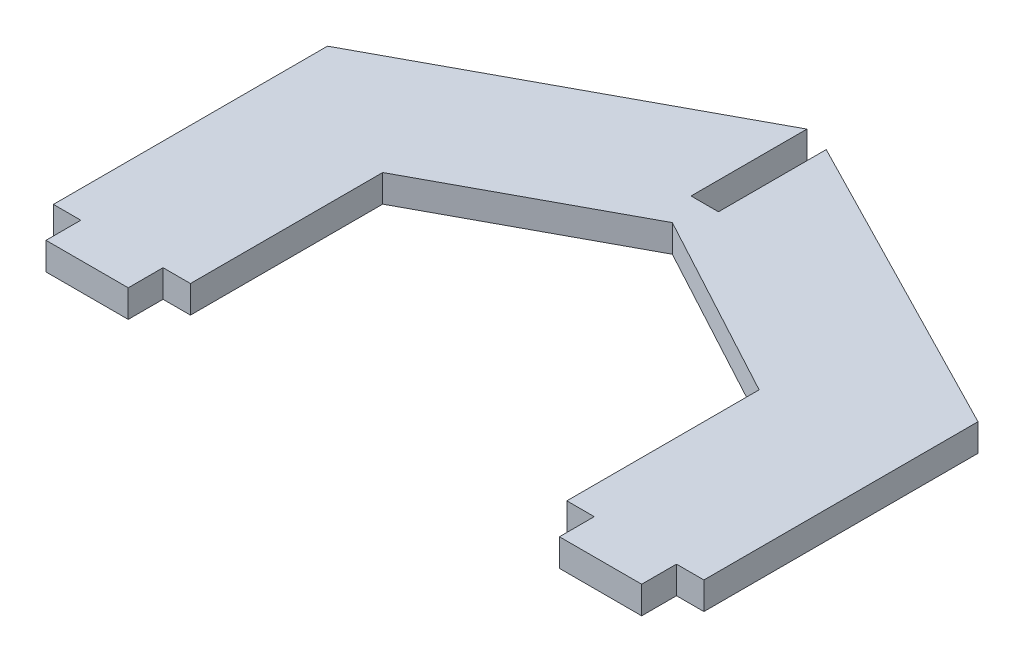
ISO-10303-21;
HEADER;
FILE_DESCRIPTION(('STEP AP214'),'2;1');
FILE_NAME('part.step','',(''),(''),'','','');
FILE_SCHEMA(('AUTOMOTIVE_DESIGN { 1 0 10303 214 1 1 1 1 }'));
ENDSEC;
DATA;
#1=APPLICATION_CONTEXT('core data for automotive mechanical design processes');
#2=APPLICATION_PROTOCOL_DEFINITION('international standard','automotive_design',2000,#1);
#3=PRODUCT_CONTEXT('',#1,'mechanical');
#4=PRODUCT('Part','Part','',(#3));
#5=PRODUCT_RELATED_PRODUCT_CATEGORY('part','',(#4));
#6=PRODUCT_DEFINITION_FORMATION('','',#4);
#7=PRODUCT_DEFINITION_CONTEXT('part definition',#1,'design');
#8=PRODUCT_DEFINITION('design','',#6,#7);
#9=PRODUCT_DEFINITION_SHAPE('','',#8);
#10=(LENGTH_UNIT() NAMED_UNIT(*) SI_UNIT(.MILLI.,.METRE.));
#11=(NAMED_UNIT(*) PLANE_ANGLE_UNIT() SI_UNIT($,.RADIAN.));
#12=(NAMED_UNIT(*) SI_UNIT($,.STERADIAN.) SOLID_ANGLE_UNIT());
#13=UNCERTAINTY_MEASURE_WITH_UNIT(LENGTH_MEASURE(1.E-05),#10,'distance_accuracy_value','');
#14=(GEOMETRIC_REPRESENTATION_CONTEXT(3) GLOBAL_UNCERTAINTY_ASSIGNED_CONTEXT((#13)) GLOBAL_UNIT_ASSIGNED_CONTEXT((#10,
#11,#12)) REPRESENTATION_CONTEXT('',''));
#15=CARTESIAN_POINT('',(0.,0.,0.));
#16=DIRECTION('',(0.,0.,1.));
#17=DIRECTION('',(1.,0.,0.));
#18=AXIS2_PLACEMENT_3D('',#15,#16,#17);
#19=CARTESIAN_POINT('',(-72.7638008545656,5.,-13.5174080075961));
#20=DIRECTION('',(1.,0.,0.));
#21=DIRECTION('',(0.,0.,-1.));
#22=AXIS2_PLACEMENT_3D('',#19,#20,#21);
#23=PLANE('',#22);
#24=DIRECTION('',(0.,0.,1.));
#25=VECTOR('',#24,1.);
#26=CARTESIAN_POINT('',(-72.7638008545656,0.,-13.5174080075961));
#27=LINE('',#26,#25);
#28=CARTESIAN_POINT('',(-72.7638008545656,0.,-13.5174080075961));
#29=VERTEX_POINT('',#28);
#30=CARTESIAN_POINT('',(-72.7638008545656,0.,36.4825919924039));
#31=VERTEX_POINT('',#30);
#32=EDGE_CURVE('E218',#29,#31,#27,.T.);
#33=ORIENTED_EDGE('',*,*,#32,.T.);
#34=DIRECTION('',(0.,-1.,0.));
#35=VECTOR('',#34,1.);
#36=CARTESIAN_POINT('',(-72.7638008545656,5.,36.4825919924039));
#37=LINE('',#36,#35);
#38=CARTESIAN_POINT('',(-72.7638008545656,5.,36.4825919924039));
#39=VERTEX_POINT('',#38);
#40=EDGE_CURVE('E11',#39,#31,#37,.T.);
#41=ORIENTED_EDGE('',*,*,#40,.F.);
#42=DIRECTION('',(0.,0.,1.));
#43=VECTOR('',#42,1.);
#44=CARTESIAN_POINT('',(-72.7638008545656,5.,-13.5174080075961));
#45=LINE('',#44,#43);
#46=CARTESIAN_POINT('',(-72.7638008545656,5.,-13.5174080075961));
#47=VERTEX_POINT('',#46);
#48=EDGE_CURVE('E279',#47,#39,#45,.T.);
#49=ORIENTED_EDGE('',*,*,#48,.F.);
#50=DIRECTION('',(0.,-1.,0.));
#51=VECTOR('',#50,1.);
#52=CARTESIAN_POINT('',(-72.7638008545656,5.,-13.5174080075961));
#53=LINE('',#52,#51);
#54=EDGE_CURVE('E214',#47,#29,#53,.T.);
#55=ORIENTED_EDGE('',*,*,#54,.T.);
#56=EDGE_LOOP('',(#33,#41,#49,#55));
#57=FACE_BOUND('',#56,.T.);
#58=ADVANCED_FACE('F39',(#57),#23,.F.);
#59=CARTESIAN_POINT('',(-72.7638008545656,5.,36.4825919924039));
#60=DIRECTION('',(0.,0.,-1.));
#61=DIRECTION('',(-1.,0.,0.));
#62=AXIS2_PLACEMENT_3D('',#59,#60,#61);
#63=PLANE('',#62);
#64=DIRECTION('',(1.,0.,0.));
#65=VECTOR('',#64,1.);
#66=CARTESIAN_POINT('',(-72.7638008545656,0.,36.4825919924039));
#67=LINE('',#66,#65);
#68=CARTESIAN_POINT('',(-67.7638008545656,0.,36.4825919924039));
#69=VERTEX_POINT('',#68);
#70=EDGE_CURVE('E222',#31,#69,#67,.T.);
#71=ORIENTED_EDGE('',*,*,#70,.T.);
#72=DIRECTION('',(0.,-1.,0.));
#73=VECTOR('',#72,1.);
#74=CARTESIAN_POINT('',(-67.7638008545656,5.,36.4825919924039));
#75=LINE('',#74,#73);
#76=CARTESIAN_POINT('',(-67.7638008545656,5.,36.4825919924039));
#77=VERTEX_POINT('',#76);
#78=EDGE_CURVE('E48',#77,#69,#75,.T.);
#79=ORIENTED_EDGE('',*,*,#78,.F.);
#80=DIRECTION('',(1.,0.,0.));
#81=VECTOR('',#80,1.);
#82=CARTESIAN_POINT('',(-72.7638008545656,5.,36.4825919924039));
#83=LINE('',#82,#81);
#84=EDGE_CURVE('E138',#39,#77,#83,.T.);
#85=ORIENTED_EDGE('',*,*,#84,.F.);
#86=ORIENTED_EDGE('',*,*,#40,.T.);
#87=EDGE_LOOP('',(#71,#79,#85,#86));
#88=FACE_BOUND('',#87,.T.);
#89=ADVANCED_FACE('F436',(#88),#63,.F.);
#90=CARTESIAN_POINT('',(-67.7638008545656,5.,36.4825919924039));
#91=DIRECTION('',(1.,0.,0.));
#92=DIRECTION('',(0.,0.,-1.));
#93=AXIS2_PLACEMENT_3D('',#90,#91,#92);
#94=PLANE('',#93);
#95=DIRECTION('',(0.,0.,1.));
#96=VECTOR('',#95,1.);
#97=CARTESIAN_POINT('',(-67.7638008545656,0.,36.4825919924039));
#98=LINE('',#97,#96);
#99=CARTESIAN_POINT('',(-67.7638008545656,0.,42.8325919924039));
#100=VERTEX_POINT('',#99);
#101=EDGE_CURVE('E225',#69,#100,#98,.T.);
#102=ORIENTED_EDGE('',*,*,#101,.T.);
#103=DIRECTION('',(0.,-1.,0.));
#104=VECTOR('',#103,1.);
#105=CARTESIAN_POINT('',(-67.7638008545656,5.,42.8325919924039));
#106=LINE('',#105,#104);
#107=CARTESIAN_POINT('',(-67.7638008545656,5.,42.8325919924039));
#108=VERTEX_POINT('',#107);
#109=EDGE_CURVE('E342',#108,#100,#106,.T.);
#110=ORIENTED_EDGE('',*,*,#109,.F.);
#111=DIRECTION('',(0.,0.,1.));
#112=VECTOR('',#111,1.);
#113=CARTESIAN_POINT('',(-67.7638008545656,5.,36.4825919924039));
#114=LINE('',#113,#112);
#115=EDGE_CURVE('E352',#77,#108,#114,.T.);
#116=ORIENTED_EDGE('',*,*,#115,.F.);
#117=ORIENTED_EDGE('',*,*,#78,.T.);
#118=EDGE_LOOP('',(#102,#110,#116,#117));
#119=FACE_BOUND('',#118,.T.);
#120=ADVANCED_FACE('F350',(#119),#94,.F.);
#121=CARTESIAN_POINT('',(-67.7638008545656,5.,42.8325919924039));
#122=DIRECTION('',(0.,0.,-1.));
#123=DIRECTION('',(-1.,0.,0.));
#124=AXIS2_PLACEMENT_3D('',#121,#122,#123);
#125=PLANE('',#124);
#126=DIRECTION('',(1.,0.,0.));
#127=VECTOR('',#126,1.);
#128=CARTESIAN_POINT('',(-67.7638008545656,0.,42.8325919924039));
#129=LINE('',#128,#127);
#130=CARTESIAN_POINT('',(-52.7638008545656,0.,42.8325919924039));
#131=VERTEX_POINT('',#130);
#132=EDGE_CURVE('E228',#100,#131,#129,.T.);
#133=ORIENTED_EDGE('',*,*,#132,.T.);
#134=DIRECTION('',(0.,-1.,0.));
#135=VECTOR('',#134,1.);
#136=CARTESIAN_POINT('',(-52.7638008545656,5.,42.8325919924039));
#137=LINE('',#136,#135);
#138=CARTESIAN_POINT('',(-52.7638008545656,5.,42.8325919924039));
#139=VERTEX_POINT('',#138);
#140=EDGE_CURVE('E338',#139,#131,#137,.T.);
#141=ORIENTED_EDGE('',*,*,#140,.F.);
#142=DIRECTION('',(1.,0.,0.));
#143=VECTOR('',#142,1.);
#144=CARTESIAN_POINT('',(-67.7638008545656,5.,42.8325919924039));
#145=LINE('',#144,#143);
#146=EDGE_CURVE('E371',#108,#139,#145,.T.);
#147=ORIENTED_EDGE('',*,*,#146,.F.);
#148=ORIENTED_EDGE('',*,*,#109,.T.);
#149=EDGE_LOOP('',(#133,#141,#147,#148));
#150=FACE_BOUND('',#149,.T.);
#151=ADVANCED_FACE('F361',(#150),#125,.F.);
#152=CARTESIAN_POINT('',(-52.7638008545656,5.,42.8325919924039));
#153=DIRECTION('',(-1.,0.,0.));
#154=DIRECTION('',(0.,0.,1.));
#155=AXIS2_PLACEMENT_3D('',#152,#153,#154);
#156=PLANE('',#155);
#157=DIRECTION('',(0.,0.,-1.));
#158=VECTOR('',#157,1.);
#159=CARTESIAN_POINT('',(-52.7638008545656,0.,42.8325919924039));
#160=LINE('',#159,#158);
#161=CARTESIAN_POINT('',(-52.7638008545656,0.,36.4825919924039));
#162=VERTEX_POINT('',#161);
#163=EDGE_CURVE('E231',#131,#162,#160,.T.);
#164=ORIENTED_EDGE('',*,*,#163,.T.);
#165=DIRECTION('',(0.,-1.,0.));
#166=VECTOR('',#165,1.);
#167=CARTESIAN_POINT('',(-52.7638008545656,5.,36.4825919924039));
#168=LINE('',#167,#166);
#169=CARTESIAN_POINT('',(-52.7638008545656,5.,36.4825919924039));
#170=VERTEX_POINT('',#169);
#171=EDGE_CURVE('E334',#170,#162,#168,.T.);
#172=ORIENTED_EDGE('',*,*,#171,.F.);
#173=DIRECTION('',(0.,0.,-1.));
#174=VECTOR('',#173,1.);
#175=CARTESIAN_POINT('',(-52.7638008545656,5.,42.8325919924039));
#176=LINE('',#175,#174);
#177=EDGE_CURVE('E367',#139,#170,#176,.T.);
#178=ORIENTED_EDGE('',*,*,#177,.F.);
#179=ORIENTED_EDGE('',*,*,#140,.T.);
#180=EDGE_LOOP('',(#164,#172,#178,#179));
#181=FACE_BOUND('',#180,.T.);
#182=ADVANCED_FACE('F365',(#181),#156,.F.);
#183=CARTESIAN_POINT('',(-52.7638008545656,5.,36.4825919924039));
#184=DIRECTION('',(0.,0.,-1.));
#185=DIRECTION('',(-1.,0.,0.));
#186=AXIS2_PLACEMENT_3D('',#183,#184,#185);
#187=PLANE('',#186);
#188=DIRECTION('',(1.,0.,0.));
#189=VECTOR('',#188,1.);
#190=CARTESIAN_POINT('',(-52.7638008545656,0.,36.4825919924039));
#191=LINE('',#190,#189);
#192=CARTESIAN_POINT('',(-47.7638008545656,0.,36.4825919924039));
#193=VERTEX_POINT('',#192);
#194=EDGE_CURVE('E234',#162,#193,#191,.T.);
#195=ORIENTED_EDGE('',*,*,#194,.T.);
#196=DIRECTION('',(0.,-1.,0.));
#197=VECTOR('',#196,1.);
#198=CARTESIAN_POINT('',(-47.7638008545656,5.,36.4825919924039));
#199=LINE('',#198,#197);
#200=CARTESIAN_POINT('',(-47.7638008545656,5.,36.4825919924039));
#201=VERTEX_POINT('',#200);
#202=EDGE_CURVE('E330',#201,#193,#199,.T.);
#203=ORIENTED_EDGE('',*,*,#202,.F.);
#204=DIRECTION('',(1.,0.,0.));
#205=VECTOR('',#204,1.);
#206=CARTESIAN_POINT('',(-52.7638008545656,5.,36.4825919924039));
#207=LINE('',#206,#205);
#208=EDGE_CURVE('E370',#170,#201,#207,.T.);
#209=ORIENTED_EDGE('',*,*,#208,.F.);
#210=ORIENTED_EDGE('',*,*,#171,.T.);
#211=EDGE_LOOP('',(#195,#203,#209,#210));
#212=FACE_BOUND('',#211,.T.);
#213=ADVANCED_FACE('F449',(#212),#187,.F.);
#214=CARTESIAN_POINT('',(-47.7638008545656,5.,36.4825919924039));
#215=DIRECTION('',(-1.,0.,0.));
#216=DIRECTION('',(0.,0.,1.));
#217=AXIS2_PLACEMENT_3D('',#214,#215,#216);
#218=PLANE('',#217);
#219=DIRECTION('',(0.,0.,-1.));
#220=VECTOR('',#219,1.);
#221=CARTESIAN_POINT('',(-47.7638008545656,0.,36.4825919924039));
#222=LINE('',#221,#220);
#223=CARTESIAN_POINT('',(-47.7638008545656,0.,1.40972797960148));
#224=VERTEX_POINT('',#223);
#225=EDGE_CURVE('E237',#193,#224,#222,.T.);
#226=ORIENTED_EDGE('',*,*,#225,.T.);
#227=DIRECTION('',(0.,-1.,0.));
#228=VECTOR('',#227,1.);
#229=CARTESIAN_POINT('',(-47.7638008545656,5.,1.40972797960148));
#230=LINE('',#229,#228);
#231=CARTESIAN_POINT('',(-47.7638008545656,5.,1.40972797960148));
#232=VERTEX_POINT('',#231);
#233=EDGE_CURVE('E326',#232,#224,#230,.T.);
#234=ORIENTED_EDGE('',*,*,#233,.F.);
#235=DIRECTION('',(0.,0.,-1.));
#236=VECTOR('',#235,1.);
#237=CARTESIAN_POINT('',(-47.7638008545656,5.,36.4825919924039));
#238=LINE('',#237,#236);
#239=EDGE_CURVE('E375',#201,#232,#238,.T.);
#240=ORIENTED_EDGE('',*,*,#239,.F.);
#241=ORIENTED_EDGE('',*,*,#202,.T.);
#242=EDGE_LOOP('',(#226,#234,#240,#241));
#243=FACE_BOUND('',#242,.T.);
#244=ADVANCED_FACE('F452',(#243),#218,.F.);
#245=CARTESIAN_POINT('',(-47.7638008545656,5.,1.40972797960148));
#246=DIRECTION('',(-0.474370622495796,0.,-0.880325231100956));
#247=DIRECTION('',(-0.880325231100956,0.,0.474370622495796));
#248=AXIS2_PLACEMENT_3D('',#245,#246,#247);
#249=PLANE('',#248);
#250=DIRECTION('',(0.880325231100956,0.,-0.474370622495796));
#251=VECTOR('',#250,1.);
#252=CARTESIAN_POINT('',(-47.7638008545656,0.,1.40972797960148));
#253=LINE('',#252,#251);
#254=CARTESIAN_POINT('',(-13.434360787078,0.,-17.0889782705647));
#255=VERTEX_POINT('',#254);
#256=EDGE_CURVE('E240',#224,#255,#253,.T.);
#257=ORIENTED_EDGE('',*,*,#256,.T.);
#258=DIRECTION('',(0.,-1.,0.));
#259=VECTOR('',#258,1.);
#260=CARTESIAN_POINT('',(-13.434360787078,5.,-17.0889782705647));
#261=LINE('',#260,#259);
#262=CARTESIAN_POINT('',(-13.434360787078,5.,-17.0889782705647));
#263=VERTEX_POINT('',#262);
#264=EDGE_CURVE('E322',#263,#255,#261,.T.);
#265=ORIENTED_EDGE('',*,*,#264,.F.);
#266=DIRECTION('',(0.880325231100956,0.,-0.474370622495796));
#267=VECTOR('',#266,1.);
#268=CARTESIAN_POINT('',(-47.7638008545656,5.,1.40972797960148));
#269=LINE('',#268,#267);
#270=EDGE_CURVE('E382',#232,#263,#269,.T.);
#271=ORIENTED_EDGE('',*,*,#270,.F.);
#272=ORIENTED_EDGE('',*,*,#233,.T.);
#273=EDGE_LOOP('',(#257,#265,#271,#272));
#274=FACE_BOUND('',#273,.T.);
#275=ADVANCED_FACE('F456',(#274),#249,.F.);
#276=CARTESIAN_POINT('',(-13.434360787078,5.,-17.0889782705647));
#277=DIRECTION('',(0.474370622495794,0.,-0.880325231100957));
#278=DIRECTION('',(-0.880325231100957,0.,-0.474370622495794));
#279=AXIS2_PLACEMENT_3D('',#276,#277,#278);
#280=PLANE('',#279);
#281=DIRECTION('',(0.880325231100956,0.,0.474370622495794));
#282=VECTOR('',#281,1.);
#283=CARTESIAN_POINT('',(-13.434360787078,0.,-17.0889782705647));
#284=LINE('',#283,#282);
#285=CARTESIAN_POINT('',(20.8950792804097,0.,1.40972797960143));
#286=VERTEX_POINT('',#285);
#287=EDGE_CURVE('E243',#255,#286,#284,.T.);
#288=ORIENTED_EDGE('',*,*,#287,.T.);
#289=DIRECTION('',(0.,-1.,0.));
#290=VECTOR('',#289,1.);
#291=CARTESIAN_POINT('',(20.8950792804097,5.,1.40972797960143));
#292=LINE('',#291,#290);
#293=CARTESIAN_POINT('',(20.8950792804097,5.,1.40972797960143));
#294=VERTEX_POINT('',#293);
#295=EDGE_CURVE('E318',#294,#286,#292,.T.);
#296=ORIENTED_EDGE('',*,*,#295,.F.);
#297=DIRECTION('',(0.880325231100956,0.,0.474370622495794));
#298=VECTOR('',#297,1.);
#299=CARTESIAN_POINT('',(-13.434360787078,5.,-17.0889782705647));
#300=LINE('',#299,#298);
#301=EDGE_CURVE('E385',#263,#294,#300,.T.);
#302=ORIENTED_EDGE('',*,*,#301,.F.);
#303=ORIENTED_EDGE('',*,*,#264,.T.);
#304=EDGE_LOOP('',(#288,#296,#302,#303));
#305=FACE_BOUND('',#304,.T.);
#306=ADVANCED_FACE('F460',(#305),#280,.F.);
#307=CARTESIAN_POINT('',(20.8950792804097,5.,1.40972797960143));
#308=DIRECTION('',(1.,0.,0.));
#309=DIRECTION('',(0.,0.,-1.));
#310=AXIS2_PLACEMENT_3D('',#307,#308,#309);
#311=PLANE('',#310);
#312=DIRECTION('',(0.,0.,1.));
#313=VECTOR('',#312,1.);
#314=CARTESIAN_POINT('',(20.8950792804097,0.,1.40972797960143));
#315=LINE('',#314,#313);
#316=CARTESIAN_POINT('',(20.8950792804097,0.,36.4825919924039));
#317=VERTEX_POINT('',#316);
#318=EDGE_CURVE('E246',#286,#317,#315,.T.);
#319=ORIENTED_EDGE('',*,*,#318,.T.);
#320=DIRECTION('',(0.,-1.,0.));
#321=VECTOR('',#320,1.);
#322=CARTESIAN_POINT('',(20.8950792804097,5.,36.4825919924039));
#323=LINE('',#322,#321);
#324=CARTESIAN_POINT('',(20.8950792804097,5.,36.4825919924039));
#325=VERTEX_POINT('',#324);
#326=EDGE_CURVE('E314',#325,#317,#323,.T.);
#327=ORIENTED_EDGE('',*,*,#326,.F.);
#328=DIRECTION('',(0.,0.,1.));
#329=VECTOR('',#328,1.);
#330=CARTESIAN_POINT('',(20.8950792804097,5.,1.40972797960143));
#331=LINE('',#330,#329);
#332=EDGE_CURVE('E388',#294,#325,#331,.T.);
#333=ORIENTED_EDGE('',*,*,#332,.F.);
#334=ORIENTED_EDGE('',*,*,#295,.T.);
#335=EDGE_LOOP('',(#319,#327,#333,#334));
#336=FACE_BOUND('',#335,.T.);
#337=ADVANCED_FACE('F464',(#336),#311,.F.);
#338=CARTESIAN_POINT('',(20.8950792804097,5.,36.4825919924039));
#339=DIRECTION('',(0.,0.,-1.));
#340=DIRECTION('',(-1.,0.,0.));
#341=AXIS2_PLACEMENT_3D('',#338,#339,#340);
#342=PLANE('',#341);
#343=DIRECTION('',(1.,0.,0.));
#344=VECTOR('',#343,1.);
#345=CARTESIAN_POINT('',(20.8950792804097,0.,36.4825919924039));
#346=LINE('',#345,#344);
#347=CARTESIAN_POINT('',(25.8950792804097,0.,36.4825919924039));
#348=VERTEX_POINT('',#347);
#349=EDGE_CURVE('E249',#317,#348,#346,.T.);
#350=ORIENTED_EDGE('',*,*,#349,.T.);
#351=DIRECTION('',(0.,-1.,0.));
#352=VECTOR('',#351,1.);
#353=CARTESIAN_POINT('',(25.8950792804097,5.,36.4825919924039));
#354=LINE('',#353,#352);
#355=CARTESIAN_POINT('',(25.8950792804097,5.,36.4825919924039));
#356=VERTEX_POINT('',#355);
#357=EDGE_CURVE('E310',#356,#348,#354,.T.);
#358=ORIENTED_EDGE('',*,*,#357,.F.);
#359=DIRECTION('',(1.,0.,0.));
#360=VECTOR('',#359,1.);
#361=CARTESIAN_POINT('',(20.8950792804097,5.,36.4825919924039));
#362=LINE('',#361,#360);
#363=EDGE_CURVE('E391',#325,#356,#362,.T.);
#364=ORIENTED_EDGE('',*,*,#363,.F.);
#365=ORIENTED_EDGE('',*,*,#326,.T.);
#366=EDGE_LOOP('',(#350,#358,#364,#365));
#367=FACE_BOUND('',#366,.T.);
#368=ADVANCED_FACE('F468',(#367),#342,.F.);
#369=CARTESIAN_POINT('',(25.8950792804097,5.,36.4825919924039));
#370=DIRECTION('',(1.,0.,0.));
#371=DIRECTION('',(0.,0.,-1.));
#372=AXIS2_PLACEMENT_3D('',#369,#370,#371);
#373=PLANE('',#372);
#374=DIRECTION('',(0.,0.,1.));
#375=VECTOR('',#374,1.);
#376=CARTESIAN_POINT('',(25.8950792804097,0.,36.4825919924039));
#377=LINE('',#376,#375);
#378=CARTESIAN_POINT('',(25.8950792804097,0.,42.8325919924039));
#379=VERTEX_POINT('',#378);
#380=EDGE_CURVE('E252',#348,#379,#377,.T.);
#381=ORIENTED_EDGE('',*,*,#380,.T.);
#382=DIRECTION('',(0.,-1.,0.));
#383=VECTOR('',#382,1.);
#384=CARTESIAN_POINT('',(25.8950792804097,5.,42.8325919924039));
#385=LINE('',#384,#383);
#386=CARTESIAN_POINT('',(25.8950792804097,5.,42.8325919924039));
#387=VERTEX_POINT('',#386);
#388=EDGE_CURVE('E306',#387,#379,#385,.T.);
#389=ORIENTED_EDGE('',*,*,#388,.F.);
#390=DIRECTION('',(0.,0.,1.));
#391=VECTOR('',#390,1.);
#392=CARTESIAN_POINT('',(25.8950792804097,5.,36.4825919924039));
#393=LINE('',#392,#391);
#394=EDGE_CURVE('E394',#356,#387,#393,.T.);
#395=ORIENTED_EDGE('',*,*,#394,.F.);
#396=ORIENTED_EDGE('',*,*,#357,.T.);
#397=EDGE_LOOP('',(#381,#389,#395,#396));
#398=FACE_BOUND('',#397,.T.);
#399=ADVANCED_FACE('F472',(#398),#373,.F.);
#400=CARTESIAN_POINT('',(25.8950792804097,5.,42.8325919924039));
#401=DIRECTION('',(0.,0.,-1.));
#402=DIRECTION('',(-1.,0.,0.));
#403=AXIS2_PLACEMENT_3D('',#400,#401,#402);
#404=PLANE('',#403);
#405=DIRECTION('',(1.,0.,0.));
#406=VECTOR('',#405,1.);
#407=CARTESIAN_POINT('',(25.8950792804097,0.,42.8325919924039));
#408=LINE('',#407,#406);
#409=CARTESIAN_POINT('',(40.8950792804097,0.,42.8325919924039));
#410=VERTEX_POINT('',#409);
#411=EDGE_CURVE('E255',#379,#410,#408,.T.);
#412=ORIENTED_EDGE('',*,*,#411,.T.);
#413=DIRECTION('',(0.,-1.,0.));
#414=VECTOR('',#413,1.);
#415=CARTESIAN_POINT('',(40.8950792804097,5.,42.8325919924039));
#416=LINE('',#415,#414);
#417=CARTESIAN_POINT('',(40.8950792804097,5.,42.8325919924039));
#418=VERTEX_POINT('',#417);
#419=EDGE_CURVE('E302',#418,#410,#416,.T.);
#420=ORIENTED_EDGE('',*,*,#419,.F.);
#421=DIRECTION('',(1.,0.,0.));
#422=VECTOR('',#421,1.);
#423=CARTESIAN_POINT('',(25.8950792804097,5.,42.8325919924039));
#424=LINE('',#423,#422);
#425=EDGE_CURVE('E397',#387,#418,#424,.T.);
#426=ORIENTED_EDGE('',*,*,#425,.F.);
#427=ORIENTED_EDGE('',*,*,#388,.T.);
#428=EDGE_LOOP('',(#412,#420,#426,#427));
#429=FACE_BOUND('',#428,.T.);
#430=ADVANCED_FACE('F476',(#429),#404,.F.);
#431=CARTESIAN_POINT('',(40.8950792804097,5.,42.8325919924039));
#432=DIRECTION('',(-1.,0.,0.));
#433=DIRECTION('',(0.,0.,1.));
#434=AXIS2_PLACEMENT_3D('',#431,#432,#433);
#435=PLANE('',#434);
#436=DIRECTION('',(0.,0.,-1.));
#437=VECTOR('',#436,1.);
#438=CARTESIAN_POINT('',(40.8950792804097,0.,42.8325919924039));
#439=LINE('',#438,#437);
#440=CARTESIAN_POINT('',(40.8950792804097,0.,36.4825919924039));
#441=VERTEX_POINT('',#440);
#442=EDGE_CURVE('E258',#410,#441,#439,.T.);
#443=ORIENTED_EDGE('',*,*,#442,.T.);
#444=DIRECTION('',(0.,-1.,0.));
#445=VECTOR('',#444,1.);
#446=CARTESIAN_POINT('',(40.8950792804097,5.,36.4825919924039));
#447=LINE('',#446,#445);
#448=CARTESIAN_POINT('',(40.8950792804097,5.,36.4825919924039));
#449=VERTEX_POINT('',#448);
#450=EDGE_CURVE('E298',#449,#441,#447,.T.);
#451=ORIENTED_EDGE('',*,*,#450,.F.);
#452=DIRECTION('',(0.,0.,-1.));
#453=VECTOR('',#452,1.);
#454=CARTESIAN_POINT('',(40.8950792804097,5.,42.8325919924039));
#455=LINE('',#454,#453);
#456=EDGE_CURVE('E400',#418,#449,#455,.T.);
#457=ORIENTED_EDGE('',*,*,#456,.F.);
#458=ORIENTED_EDGE('',*,*,#419,.T.);
#459=EDGE_LOOP('',(#443,#451,#457,#458));
#460=FACE_BOUND('',#459,.T.);
#461=ADVANCED_FACE('F480',(#460),#435,.F.);
#462=CARTESIAN_POINT('',(40.8950792804097,5.,36.4825919924039));
#463=DIRECTION('',(0.,0.,-1.));
#464=DIRECTION('',(-1.,0.,0.));
#465=AXIS2_PLACEMENT_3D('',#462,#463,#464);
#466=PLANE('',#465);
#467=DIRECTION('',(1.,0.,0.));
#468=VECTOR('',#467,1.);
#469=CARTESIAN_POINT('',(40.8950792804097,0.,36.4825919924039));
#470=LINE('',#469,#468);
#471=CARTESIAN_POINT('',(45.8950792804097,0.,36.4825919924039));
#472=VERTEX_POINT('',#471);
#473=EDGE_CURVE('E261',#441,#472,#470,.T.);
#474=ORIENTED_EDGE('',*,*,#473,.T.);
#475=DIRECTION('',(0.,-1.,0.));
#476=VECTOR('',#475,1.);
#477=CARTESIAN_POINT('',(45.8950792804097,5.,36.4825919924039));
#478=LINE('',#477,#476);
#479=CARTESIAN_POINT('',(45.8950792804097,5.,36.4825919924039));
#480=VERTEX_POINT('',#479);
#481=EDGE_CURVE('E294',#480,#472,#478,.T.);
#482=ORIENTED_EDGE('',*,*,#481,.F.);
#483=DIRECTION('',(1.,0.,0.));
#484=VECTOR('',#483,1.);
#485=CARTESIAN_POINT('',(40.8950792804097,5.,36.4825919924039));
#486=LINE('',#485,#484);
#487=EDGE_CURVE('E403',#449,#480,#486,.T.);
#488=ORIENTED_EDGE('',*,*,#487,.F.);
#489=ORIENTED_EDGE('',*,*,#450,.T.);
#490=EDGE_LOOP('',(#474,#482,#488,#489));
#491=FACE_BOUND('',#490,.T.);
#492=ADVANCED_FACE('F484',(#491),#466,.F.);
#493=CARTESIAN_POINT('',(45.8950792804097,5.,36.4825919924039));
#494=DIRECTION('',(-1.,0.,0.));
#495=DIRECTION('',(0.,0.,1.));
#496=AXIS2_PLACEMENT_3D('',#493,#494,#495);
#497=PLANE('',#496);
#498=DIRECTION('',(0.,0.,-1.));
#499=VECTOR('',#498,1.);
#500=CARTESIAN_POINT('',(45.8950792804097,0.,36.4825919924039));
#501=LINE('',#500,#499);
#502=CARTESIAN_POINT('',(45.8950792804097,0.,-13.5174080075961));
#503=VERTEX_POINT('',#502);
#504=EDGE_CURVE('E264',#472,#503,#501,.T.);
#505=ORIENTED_EDGE('',*,*,#504,.T.);
#506=DIRECTION('',(0.,-1.,0.));
#507=VECTOR('',#506,1.);
#508=CARTESIAN_POINT('',(45.8950792804097,5.,-13.5174080075961));
#509=LINE('',#508,#507);
#510=CARTESIAN_POINT('',(45.8950792804097,5.,-13.5174080075961));
#511=VERTEX_POINT('',#510);
#512=EDGE_CURVE('E290',#511,#503,#509,.T.);
#513=ORIENTED_EDGE('',*,*,#512,.F.);
#514=DIRECTION('',(0.,0.,-1.));
#515=VECTOR('',#514,1.);
#516=CARTESIAN_POINT('',(45.8950792804097,5.,36.4825919924039));
#517=LINE('',#516,#515);
#518=EDGE_CURVE('E406',#480,#511,#517,.T.);
#519=ORIENTED_EDGE('',*,*,#518,.F.);
#520=ORIENTED_EDGE('',*,*,#481,.T.);
#521=EDGE_LOOP('',(#505,#513,#519,#520));
#522=FACE_BOUND('',#521,.T.);
#523=ADVANCED_FACE('F488',(#522),#497,.F.);
#524=CARTESIAN_POINT('',(45.8950792804097,5.,-13.5174080075961));
#525=DIRECTION('',(-0.456328015258492,0.,0.889811633150661));
#526=DIRECTION('',(0.889811633150661,0.,0.456328015258492));
#527=AXIS2_PLACEMENT_3D('',#524,#525,#526);
#528=PLANE('',#527);
#529=DIRECTION('',(-0.889811633150661,0.,-0.456328015258492));
#530=VECTOR('',#529,1.);
#531=CARTESIAN_POINT('',(45.8950792804097,0.,-13.5174080075961));
#532=LINE('',#531,#530);
#533=CARTESIAN_POINT('',(-10.934360787078,0.,-42.6616275571029));
#534=VERTEX_POINT('',#533);
#535=EDGE_CURVE('E267',#503,#534,#532,.T.);
#536=ORIENTED_EDGE('',*,*,#535,.T.);
#537=DIRECTION('',(0.,-1.,0.));
#538=VECTOR('',#537,1.);
#539=CARTESIAN_POINT('',(-10.934360787078,5.,-42.6616275571029));
#540=LINE('',#539,#538);
#541=CARTESIAN_POINT('',(-10.934360787078,5.,-42.6616275571029));
#542=VERTEX_POINT('',#541);
#543=EDGE_CURVE('E286',#542,#534,#540,.T.);
#544=ORIENTED_EDGE('',*,*,#543,.F.);
#545=DIRECTION('',(-0.889811633150661,0.,-0.456328015258492));
#546=VECTOR('',#545,1.);
#547=CARTESIAN_POINT('',(45.8950792804097,5.,-13.5174080075961));
#548=LINE('',#547,#546);
#549=EDGE_CURVE('E409',#511,#542,#548,.T.);
#550=ORIENTED_EDGE('',*,*,#549,.F.);
#551=ORIENTED_EDGE('',*,*,#512,.T.);
#552=EDGE_LOOP('',(#536,#544,#550,#551));
#553=FACE_BOUND('',#552,.T.);
#554=ADVANCED_FACE('F417',(#553),#528,.F.);
#555=CARTESIAN_POINT('',(-10.934360787078,5.,-23.003270855678));
#556=DIRECTION('',(1.,0.,0.));
#557=DIRECTION('',(0.,0.,-1.));
#558=AXIS2_PLACEMENT_3D('',#555,#556,#557);
#559=PLANE('',#558);
#560=DIRECTION('',(0.,0.,1.));
#561=VECTOR('',#560,1.);
#562=CARTESIAN_POINT('',(-10.934360787078,0.,-23.003270855678));
#563=LINE('',#562,#561);
#564=CARTESIAN_POINT('',(-10.934360787078,0.,-23.003270855678));
#565=VERTEX_POINT('',#564);
#566=EDGE_CURVE('E270',#534,#565,#563,.T.);
#567=ORIENTED_EDGE('',*,*,#566,.T.);
#568=DIRECTION('',(0.,-1.,0.));
#569=VECTOR('',#568,1.);
#570=CARTESIAN_POINT('',(-10.934360787078,5.,-23.003270855678));
#571=LINE('',#570,#569);
#572=CARTESIAN_POINT('',(-10.934360787078,5.,-23.003270855678));
#573=VERTEX_POINT('',#572);
#574=EDGE_CURVE('E207',#573,#565,#571,.T.);
#575=ORIENTED_EDGE('',*,*,#574,.F.);
#576=DIRECTION('',(0.,0.,1.));
#577=VECTOR('',#576,1.);
#578=CARTESIAN_POINT('',(-10.934360787078,5.,-23.003270855678));
#579=LINE('',#578,#577);
#580=EDGE_CURVE('E196',#542,#573,#579,.T.);
#581=ORIENTED_EDGE('',*,*,#580,.F.);
#582=ORIENTED_EDGE('',*,*,#543,.T.);
#583=EDGE_LOOP('',(#567,#575,#581,#582));
#584=FACE_BOUND('',#583,.T.);
#585=ADVANCED_FACE('F421',(#584),#559,.F.);
#586=CARTESIAN_POINT('',(-15.934360787078,5.,-23.003270855678));
#587=DIRECTION('',(0.,0.,1.));
#588=DIRECTION('',(1.,0.,0.));
#589=AXIS2_PLACEMENT_3D('',#586,#587,#588);
#590=PLANE('',#589);
#591=DIRECTION('',(-1.,0.,0.));
#592=VECTOR('',#591,1.);
#593=CARTESIAN_POINT('',(-15.934360787078,0.,-23.003270855678));
#594=LINE('',#593,#592);
#595=CARTESIAN_POINT('',(-15.934360787078,0.,-23.003270855678));
#596=VERTEX_POINT('',#595);
#597=EDGE_CURVE('E205',#565,#596,#594,.T.);
#598=ORIENTED_EDGE('',*,*,#597,.T.);
#599=DIRECTION('',(0.,-1.,0.));
#600=VECTOR('',#599,1.);
#601=CARTESIAN_POINT('',(-15.934360787078,5.,-23.003270855678));
#602=LINE('',#601,#600);
#603=CARTESIAN_POINT('',(-15.934360787078,5.,-23.003270855678));
#604=VERTEX_POINT('',#603);
#605=EDGE_CURVE('E202',#604,#596,#602,.T.);
#606=ORIENTED_EDGE('',*,*,#605,.F.);
#607=DIRECTION('',(-1.,0.,0.));
#608=VECTOR('',#607,1.);
#609=CARTESIAN_POINT('',(-15.934360787078,5.,-23.003270855678));
#610=LINE('',#609,#608);
#611=EDGE_CURVE('E190',#573,#604,#610,.T.);
#612=ORIENTED_EDGE('',*,*,#611,.F.);
#613=ORIENTED_EDGE('',*,*,#574,.T.);
#614=EDGE_LOOP('',(#598,#606,#612,#613));
#615=FACE_BOUND('',#614,.T.);
#616=ADVANCED_FACE('F203',(#615),#590,.F.);
#617=CARTESIAN_POINT('',(-15.934360787078,5.,-44.1404276695306));
#618=DIRECTION('',(-1.,0.,0.));
#619=DIRECTION('',(0.,0.,1.));
#620=AXIS2_PLACEMENT_3D('',#617,#618,#619);
#621=PLANE('',#620);
#622=DIRECTION('',(0.,0.,-1.));
#623=VECTOR('',#622,1.);
#624=CARTESIAN_POINT('',(-15.934360787078,0.,-44.1404276695306));
#625=LINE('',#624,#623);
#626=CARTESIAN_POINT('',(-15.934360787078,0.,-44.1404276695306));
#627=VERTEX_POINT('',#626);
#628=EDGE_CURVE('E124',#596,#627,#625,.T.);
#629=ORIENTED_EDGE('',*,*,#628,.T.);
#630=DIRECTION('',(0.,-1.,0.));
#631=VECTOR('',#630,1.);
#632=CARTESIAN_POINT('',(-15.934360787078,5.,-44.1404276695306));
#633=LINE('',#632,#631);
#634=CARTESIAN_POINT('',(-15.934360787078,5.,-44.1404276695306));
#635=VERTEX_POINT('',#634);
#636=EDGE_CURVE('E208',#635,#627,#633,.T.);
#637=ORIENTED_EDGE('',*,*,#636,.F.);
#638=DIRECTION('',(0.,0.,-1.));
#639=VECTOR('',#638,1.);
#640=CARTESIAN_POINT('',(-15.934360787078,5.,-44.1404276695306));
#641=LINE('',#640,#639);
#642=EDGE_CURVE('E194',#604,#635,#641,.T.);
#643=ORIENTED_EDGE('',*,*,#642,.F.);
#644=ORIENTED_EDGE('',*,*,#605,.T.);
#645=EDGE_LOOP('',(#629,#637,#643,#644));
#646=FACE_BOUND('',#645,.T.);
#647=ADVANCED_FACE('F210',(#646),#621,.F.);
#648=CARTESIAN_POINT('',(-15.934360787078,5.,-44.1404276695306));
#649=DIRECTION('',(0.474370622495795,0.,0.880325231100956));
#650=DIRECTION('',(0.880325231100956,0.,-0.474370622495795));
#651=AXIS2_PLACEMENT_3D('',#648,#649,#650);
#652=PLANE('',#651);
#653=DIRECTION('',(-0.880325231100956,0.,0.474370622495795));
#654=VECTOR('',#653,1.);
#655=CARTESIAN_POINT('',(-15.934360787078,0.,-44.1404276695306));
#656=LINE('',#655,#654);
#657=EDGE_CURVE('E130',#627,#29,#656,.T.);
#658=ORIENTED_EDGE('',*,*,#657,.T.);
#659=ORIENTED_EDGE('',*,*,#54,.F.);
#660=DIRECTION('',(-0.880325231100956,0.,0.474370622495795));
#661=VECTOR('',#660,1.);
#662=CARTESIAN_POINT('',(-15.934360787078,5.,-44.1404276695306));
#663=LINE('',#662,#661);
#664=EDGE_CURVE('E56',#635,#47,#663,.T.);
#665=ORIENTED_EDGE('',*,*,#664,.F.);
#666=ORIENTED_EDGE('',*,*,#636,.T.);
#667=EDGE_LOOP('',(#658,#659,#665,#666));
#668=FACE_BOUND('',#667,.T.);
#669=ADVANCED_FACE('F425',(#668),#652,.F.);
#670=CARTESIAN_POINT('',(0.,5.,0.));
#671=DIRECTION('',(0.,1.,0.));
#672=DIRECTION('',(0.,0.,1.));
#673=AXIS2_PLACEMENT_3D('',#670,#671,#672);
#674=PLANE('',#673);
#675=ORIENTED_EDGE('',*,*,#48,.T.);
#676=ORIENTED_EDGE('',*,*,#84,.T.);
#677=ORIENTED_EDGE('',*,*,#115,.T.);
#678=ORIENTED_EDGE('',*,*,#146,.T.);
#679=ORIENTED_EDGE('',*,*,#177,.T.);
#680=ORIENTED_EDGE('',*,*,#208,.T.);
#681=ORIENTED_EDGE('',*,*,#239,.T.);
#682=ORIENTED_EDGE('',*,*,#270,.T.);
#683=ORIENTED_EDGE('',*,*,#301,.T.);
#684=ORIENTED_EDGE('',*,*,#332,.T.);
#685=ORIENTED_EDGE('',*,*,#363,.T.);
#686=ORIENTED_EDGE('',*,*,#394,.T.);
#687=ORIENTED_EDGE('',*,*,#425,.T.);
#688=ORIENTED_EDGE('',*,*,#456,.T.);
#689=ORIENTED_EDGE('',*,*,#487,.T.);
#690=ORIENTED_EDGE('',*,*,#518,.T.);
#691=ORIENTED_EDGE('',*,*,#549,.T.);
#692=ORIENTED_EDGE('',*,*,#580,.T.);
#693=ORIENTED_EDGE('',*,*,#611,.T.);
#694=ORIENTED_EDGE('',*,*,#642,.T.);
#695=ORIENTED_EDGE('',*,*,#664,.T.);
#696=EDGE_LOOP('',(#675,#676,#677,#678,#679,#680,#681,#682,#683,#684,#685,#686,#687,#688,#689,
#690,#691,#692,#693,#694,#695));
#697=FACE_BOUND('',#696,.T.);
#698=ADVANCED_FACE('F192',(#697),#674,.T.);
#699=CARTESIAN_POINT('',(0.,0.,0.));
#700=DIRECTION('',(0.,1.,0.));
#701=DIRECTION('',(0.,0.,1.));
#702=AXIS2_PLACEMENT_3D('',#699,#700,#701);
#703=PLANE('',#702);
#704=ORIENTED_EDGE('',*,*,#32,.F.);
#705=ORIENTED_EDGE('',*,*,#657,.F.);
#706=ORIENTED_EDGE('',*,*,#628,.F.);
#707=ORIENTED_EDGE('',*,*,#597,.F.);
#708=ORIENTED_EDGE('',*,*,#566,.F.);
#709=ORIENTED_EDGE('',*,*,#535,.F.);
#710=ORIENTED_EDGE('',*,*,#504,.F.);
#711=ORIENTED_EDGE('',*,*,#473,.F.);
#712=ORIENTED_EDGE('',*,*,#442,.F.);
#713=ORIENTED_EDGE('',*,*,#411,.F.);
#714=ORIENTED_EDGE('',*,*,#380,.F.);
#715=ORIENTED_EDGE('',*,*,#349,.F.);
#716=ORIENTED_EDGE('',*,*,#318,.F.);
#717=ORIENTED_EDGE('',*,*,#287,.F.);
#718=ORIENTED_EDGE('',*,*,#256,.F.);
#719=ORIENTED_EDGE('',*,*,#225,.F.);
#720=ORIENTED_EDGE('',*,*,#194,.F.);
#721=ORIENTED_EDGE('',*,*,#163,.F.);
#722=ORIENTED_EDGE('',*,*,#132,.F.);
#723=ORIENTED_EDGE('',*,*,#101,.F.);
#724=ORIENTED_EDGE('',*,*,#70,.F.);
#725=EDGE_LOOP('',(#704,#705,#706,#707,#708,#709,#710,#711,#712,#713,#714,#715,#716,#717,#718,
#719,#720,#721,#722,#723,#724));
#726=FACE_BOUND('',#725,.T.);
#727=ADVANCED_FACE('F356',(#726),#703,.F.);
#728=CLOSED_SHELL('',(#58,#89,#120,#151,#182,#213,#244,#275,#306,#337,#368,#399,#430,#461,#492,
#523,#554,#585,#616,#647,#669,#698,#727));
#729=MANIFOLD_SOLID_BREP('B2',#728);
#730=ADVANCED_BREP_SHAPE_REPRESENTATION('',(#18,#729),#14);
#731=SHAPE_DEFINITION_REPRESENTATION(#9,#730);
ENDSEC;
END-ISO-10303-21;
